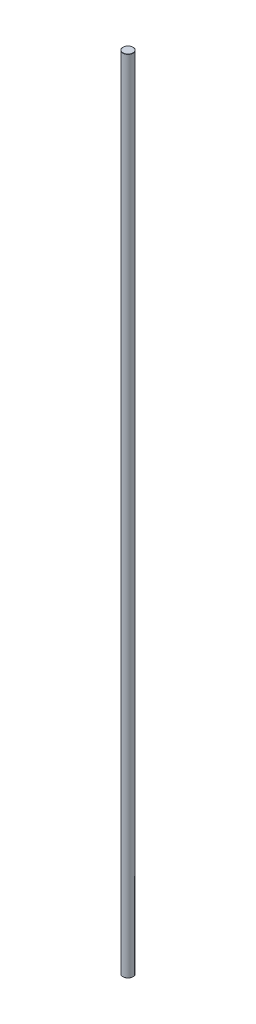
ISO-10303-21;
HEADER;
FILE_DESCRIPTION(('STEP AP214'),'2;1');
FILE_NAME('part.step','',(''),(''),'','','');
FILE_SCHEMA(('AUTOMOTIVE_DESIGN { 1 0 10303 214 1 1 1 1 }'));
ENDSEC;
DATA;
#1=APPLICATION_CONTEXT('core data for automotive mechanical design processes');
#2=APPLICATION_PROTOCOL_DEFINITION('international standard','automotive_design',2000,#1);
#3=PRODUCT_CONTEXT('',#1,'mechanical');
#4=PRODUCT('Part','Part','',(#3));
#5=PRODUCT_RELATED_PRODUCT_CATEGORY('part','',(#4));
#6=PRODUCT_DEFINITION_FORMATION('','',#4);
#7=PRODUCT_DEFINITION_CONTEXT('part definition',#1,'design');
#8=PRODUCT_DEFINITION('design','',#6,#7);
#9=PRODUCT_DEFINITION_SHAPE('','',#8);
#10=(LENGTH_UNIT() NAMED_UNIT(*) SI_UNIT(.MILLI.,.METRE.));
#11=(NAMED_UNIT(*) PLANE_ANGLE_UNIT() SI_UNIT($,.RADIAN.));
#12=(NAMED_UNIT(*) SI_UNIT($,.STERADIAN.) SOLID_ANGLE_UNIT());
#13=UNCERTAINTY_MEASURE_WITH_UNIT(LENGTH_MEASURE(1.E-05),#10,'distance_accuracy_value','');
#14=(GEOMETRIC_REPRESENTATION_CONTEXT(3) GLOBAL_UNCERTAINTY_ASSIGNED_CONTEXT((#13)) GLOBAL_UNIT_ASSIGNED_CONTEXT((#10,
#11,#12)) REPRESENTATION_CONTEXT('',''));
#15=CARTESIAN_POINT('',(0.,0.,0.));
#16=DIRECTION('',(0.,0.,1.));
#17=DIRECTION('',(1.,0.,0.));
#18=AXIS2_PLACEMENT_3D('',#15,#16,#17);
#19=CARTESIAN_POINT('',(0.,495.3,0.));
#20=DIRECTION('',(0.,-1.,0.));
#21=DIRECTION('',(0.,0.,-1.));
#22=AXIS2_PLACEMENT_3D('',#19,#20,#21);
#23=CYLINDRICAL_SURFACE('',#22,6.35);
#24=CARTESIAN_POINT('',(0.,-495.046,0.));
#25=DIRECTION('',(0.,1.,0.));
#26=DIRECTION('',(0.,0.,1.));
#27=AXIS2_PLACEMENT_3D('',#24,#25,#26);
#28=CIRCLE('',#27,6.35);
#29=CARTESIAN_POINT('',(0.,-495.046,6.35));
#30=VERTEX_POINT('',#29);
#31=EDGE_CURVE('E48',#30,#30,#28,.T.);
#32=ORIENTED_EDGE('',*,*,#31,.T.);
#33=EDGE_LOOP('',(#32));
#34=FACE_BOUND('',#33,.T.);
#35=CARTESIAN_POINT('',(0.,495.046,0.));
#36=DIRECTION('',(0.,1.,0.));
#37=DIRECTION('',(0.,0.,1.));
#38=AXIS2_PLACEMENT_3D('',#35,#36,#37);
#39=CIRCLE('',#38,6.35);
#40=CARTESIAN_POINT('',(0.,495.046,6.35));
#41=VERTEX_POINT('',#40);
#42=EDGE_CURVE('E52',#41,#41,#39,.F.);
#43=ORIENTED_EDGE('',*,*,#42,.T.);
#44=EDGE_LOOP('',(#43));
#45=FACE_BOUND('',#44,.T.);
#46=ADVANCED_FACE('F37',(#34,#45),#23,.T.);
#47=CARTESIAN_POINT('',(0.,495.3,0.));
#48=DIRECTION('',(0.,1.,0.));
#49=DIRECTION('',(0.,0.,1.));
#50=AXIS2_PLACEMENT_3D('',#47,#48,#49);
#51=PLANE('',#50);
#52=CARTESIAN_POINT('',(0.,495.3,0.));
#53=DIRECTION('',(0.,1.,0.));
#54=DIRECTION('',(0.,0.,1.));
#55=AXIS2_PLACEMENT_3D('',#52,#53,#54);
#56=CIRCLE('',#55,6.09599999999999);
#57=CARTESIAN_POINT('',(0.,495.3,6.09599999999999));
#58=VERTEX_POINT('',#57);
#59=EDGE_CURVE('E10',#58,#58,#56,.T.);
#60=ORIENTED_EDGE('',*,*,#59,.T.);
#61=EDGE_LOOP('',(#60));
#62=FACE_BOUND('',#61,.T.);
#63=ADVANCED_FACE('F68',(#62),#51,.T.);
#64=CARTESIAN_POINT('',(0.,-495.3,0.));
#65=DIRECTION('',(0.,1.,0.));
#66=DIRECTION('',(0.,0.,1.));
#67=AXIS2_PLACEMENT_3D('',#64,#65,#66);
#68=PLANE('',#67);
#69=CARTESIAN_POINT('',(0.,-495.3,0.));
#70=DIRECTION('',(0.,1.,0.));
#71=DIRECTION('',(0.,0.,1.));
#72=AXIS2_PLACEMENT_3D('',#69,#70,#71);
#73=CIRCLE('',#72,6.09599999999999);
#74=CARTESIAN_POINT('',(0.,-495.3,6.09599999999999));
#75=VERTEX_POINT('',#74);
#76=EDGE_CURVE('E44',#75,#75,#73,.F.);
#77=ORIENTED_EDGE('',*,*,#76,.T.);
#78=EDGE_LOOP('',(#77));
#79=FACE_BOUND('',#78,.T.);
#80=ADVANCED_FACE('F65',(#79),#68,.F.);
#81=CARTESIAN_POINT('',(0.,-495.046,0.));
#82=DIRECTION('',(0.,1.,0.));
#83=DIRECTION('',(0.,0.,1.));
#84=AXIS2_PLACEMENT_3D('',#81,#82,#83);
#85=CONICAL_SURFACE('',#84,6.35,0.785398163397513);
#86=ORIENTED_EDGE('',*,*,#76,.F.);
#87=EDGE_LOOP('',(#86));
#88=FACE_BOUND('',#87,.T.);
#89=ORIENTED_EDGE('',*,*,#31,.F.);
#90=EDGE_LOOP('',(#89));
#91=FACE_BOUND('',#90,.T.);
#92=ADVANCED_FACE('F61',(#88,#91),#85,.T.);
#93=CARTESIAN_POINT('',(0.,495.3,0.));
#94=DIRECTION('',(0.,-1.,0.));
#95=DIRECTION('',(0.,0.,-1.));
#96=AXIS2_PLACEMENT_3D('',#93,#94,#95);
#97=CONICAL_SURFACE('',#96,6.09599999999999,0.785398163397404);
#98=ORIENTED_EDGE('',*,*,#42,.F.);
#99=EDGE_LOOP('',(#98));
#100=FACE_BOUND('',#99,.T.);
#101=ORIENTED_EDGE('',*,*,#59,.F.);
#102=EDGE_LOOP('',(#101));
#103=FACE_BOUND('',#102,.T.);
#104=ADVANCED_FACE('F39',(#100,#103),#97,.T.);
#105=CLOSED_SHELL('',(#46,#63,#80,#92,#104));
#106=MANIFOLD_SOLID_BREP('B2',#105);
#107=ADVANCED_BREP_SHAPE_REPRESENTATION('',(#18,#106),#14);
#108=SHAPE_DEFINITION_REPRESENTATION(#9,#107);
ENDSEC;
END-ISO-10303-21;
